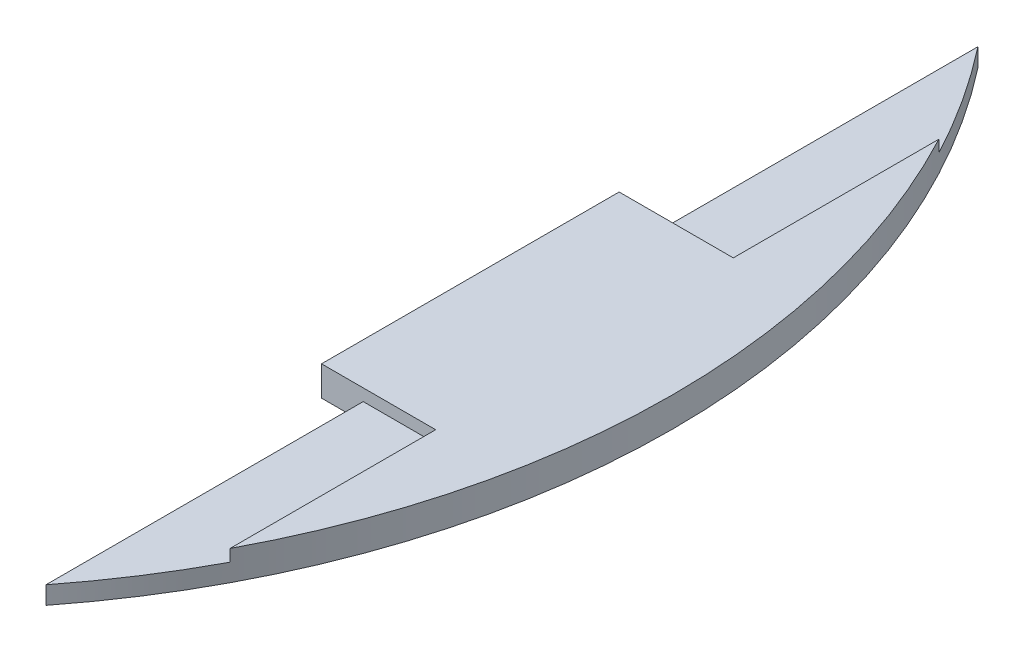
ISO-10303-21;
HEADER;
FILE_DESCRIPTION(('STEP AP214'),'2;1');
FILE_NAME('part.step','',(''),(''),'','','');
FILE_SCHEMA(('AUTOMOTIVE_DESIGN { 1 0 10303 214 1 1 1 1 }'));
ENDSEC;
DATA;
#1=APPLICATION_CONTEXT('core data for automotive mechanical design processes');
#2=APPLICATION_PROTOCOL_DEFINITION('international standard','automotive_design',2000,#1);
#3=PRODUCT_CONTEXT('',#1,'mechanical');
#4=PRODUCT('Part','Part','',(#3));
#5=PRODUCT_RELATED_PRODUCT_CATEGORY('part','',(#4));
#6=PRODUCT_DEFINITION_FORMATION('','',#4);
#7=PRODUCT_DEFINITION_CONTEXT('part definition',#1,'design');
#8=PRODUCT_DEFINITION('design','',#6,#7);
#9=PRODUCT_DEFINITION_SHAPE('','',#8);
#10=(LENGTH_UNIT() NAMED_UNIT(*) SI_UNIT(.MILLI.,.METRE.));
#11=(NAMED_UNIT(*) PLANE_ANGLE_UNIT() SI_UNIT($,.RADIAN.));
#12=(NAMED_UNIT(*) SI_UNIT($,.STERADIAN.) SOLID_ANGLE_UNIT());
#13=UNCERTAINTY_MEASURE_WITH_UNIT(LENGTH_MEASURE(1.E-05),#10,'distance_accuracy_value','');
#14=(GEOMETRIC_REPRESENTATION_CONTEXT(3) GLOBAL_UNCERTAINTY_ASSIGNED_CONTEXT((#13)) GLOBAL_UNIT_ASSIGNED_CONTEXT((#10,
#11,#12)) REPRESENTATION_CONTEXT('',''));
#15=CARTESIAN_POINT('',(0.,0.,0.));
#16=DIRECTION('',(0.,0.,1.));
#17=DIRECTION('',(1.,0.,0.));
#18=AXIS2_PLACEMENT_3D('',#15,#16,#17);
#19=CARTESIAN_POINT('',(50.,2.5,12.5));
#20=DIRECTION('',(1.,0.,0.));
#21=DIRECTION('',(0.,0.,-1.));
#22=AXIS2_PLACEMENT_3D('',#19,#20,#21);
#23=PLANE('',#22);
#24=DIRECTION('',(0.,0.,1.));
#25=VECTOR('',#24,1.);
#26=CARTESIAN_POINT('',(50.,1.5,12.5));
#27=LINE('',#26,#25);
#28=CARTESIAN_POINT('',(50.,1.5,12.5));
#29=VERTEX_POINT('',#28);
#30=CARTESIAN_POINT('',(50.,1.5,39.1439650520996));
#31=VERTEX_POINT('',#30);
#32=EDGE_CURVE('E181',#29,#31,#27,.T.);
#33=ORIENTED_EDGE('',*,*,#32,.F.);
#34=DIRECTION('',(0.,-1.,0.));
#35=VECTOR('',#34,1.);
#36=CARTESIAN_POINT('',(50.,2.5,12.5));
#37=LINE('',#36,#35);
#38=CARTESIAN_POINT('',(50.,0.,12.5));
#39=VERTEX_POINT('',#38);
#40=EDGE_CURVE('E152',#29,#39,#37,.T.);
#41=ORIENTED_EDGE('',*,*,#40,.T.);
#42=DIRECTION('',(0.,0.,1.));
#43=VECTOR('',#42,1.);
#44=CARTESIAN_POINT('',(50.,0.,12.5));
#45=LINE('',#44,#43);
#46=CARTESIAN_POINT('',(50.,0.,39.1439650520996));
#47=VERTEX_POINT('',#46);
#48=EDGE_CURVE('E118',#39,#47,#45,.T.);
#49=ORIENTED_EDGE('',*,*,#48,.T.);
#50=DIRECTION('',(0.,-1.,0.));
#51=VECTOR('',#50,1.);
#52=CARTESIAN_POINT('',(50.,2.5,39.1439650520996));
#53=LINE('',#52,#51);
#54=EDGE_CURVE('E149',#31,#47,#53,.T.);
#55=ORIENTED_EDGE('',*,*,#54,.F.);
#56=EDGE_LOOP('',(#33,#41,#49,#55));
#57=FACE_BOUND('',#56,.T.);
#58=ADVANCED_FACE('F43',(#57),#23,.F.);
#59=CARTESIAN_POINT('',(46.5,2.5,12.5));
#60=DIRECTION('',(0.,0.,-1.));
#61=DIRECTION('',(-1.,0.,0.));
#62=AXIS2_PLACEMENT_3D('',#59,#60,#61);
#63=PLANE('',#62);
#64=DIRECTION('',(1.,0.,0.));
#65=VECTOR('',#64,1.);
#66=CARTESIAN_POINT('',(46.5,0.,12.5));
#67=LINE('',#66,#65);
#68=CARTESIAN_POINT('',(46.5,0.,12.5));
#69=VERTEX_POINT('',#68);
#70=EDGE_CURVE('E110',#69,#39,#67,.T.);
#71=ORIENTED_EDGE('',*,*,#70,.T.);
#72=ORIENTED_EDGE('',*,*,#40,.F.);
#73=DIRECTION('',(-1.,0.,0.));
#74=VECTOR('',#73,1.);
#75=CARTESIAN_POINT('',(50.,1.5,12.5));
#76=LINE('',#75,#74);
#77=CARTESIAN_POINT('',(56.089,1.5,12.5));
#78=VERTEX_POINT('',#77);
#79=EDGE_CURVE('E190',#78,#29,#76,.T.);
#80=ORIENTED_EDGE('',*,*,#79,.F.);
#81=DIRECTION('',(0.,1.,0.));
#82=VECTOR('',#81,1.);
#83=CARTESIAN_POINT('',(56.089,1.5,12.5));
#84=LINE('',#83,#82);
#85=CARTESIAN_POINT('',(56.089,2.5,12.5));
#86=VERTEX_POINT('',#85);
#87=EDGE_CURVE('E194',#78,#86,#84,.T.);
#88=ORIENTED_EDGE('',*,*,#87,.T.);
#89=DIRECTION('',(1.,0.,0.));
#90=VECTOR('',#89,1.);
#91=CARTESIAN_POINT('',(46.5,2.5,12.5));
#92=LINE('',#91,#90);
#93=CARTESIAN_POINT('',(46.5,2.5,12.5));
#94=VERTEX_POINT('',#93);
#95=EDGE_CURVE('E104',#94,#86,#92,.T.);
#96=ORIENTED_EDGE('',*,*,#95,.F.);
#97=DIRECTION('',(0.,-1.,0.));
#98=VECTOR('',#97,1.);
#99=CARTESIAN_POINT('',(46.5,2.5,12.5));
#100=LINE('',#99,#98);
#101=EDGE_CURVE('E96',#94,#69,#100,.T.);
#102=ORIENTED_EDGE('',*,*,#101,.T.);
#103=EDGE_LOOP('',(#71,#72,#80,#88,#96,#102));
#104=FACE_BOUND('',#103,.T.);
#105=ADVANCED_FACE('F45',(#104),#63,.F.);
#106=CARTESIAN_POINT('',(0.,2.5,0.));
#107=DIRECTION('',(0.,-1.,0.));
#108=DIRECTION('',(0.,0.,-1.));
#109=AXIS2_PLACEMENT_3D('',#106,#107,#108);
#110=CYLINDRICAL_SURFACE('',#109,63.5);
#111=CARTESIAN_POINT('',(0.,1.5,0.));
#112=DIRECTION('',(0.,-1.,0.));
#113=DIRECTION('',(0.,0.,-1.));
#114=AXIS2_PLACEMENT_3D('',#111,#112,#113);
#115=CIRCLE('',#114,63.5);
#116=CARTESIAN_POINT('',(50.,1.5,-39.1439650520997));
#117=VERTEX_POINT('',#116);
#118=CARTESIAN_POINT('',(56.089,1.5,-29.7703557083217));
#119=VERTEX_POINT('',#118);
#120=EDGE_CURVE('E120',#117,#119,#115,.T.);
#121=ORIENTED_EDGE('',*,*,#120,.T.);
#122=DIRECTION('',(0.,-1.,0.));
#123=VECTOR('',#122,1.);
#124=CARTESIAN_POINT('',(56.089,2.5,-29.7703557083217));
#125=LINE('',#124,#123);
#126=CARTESIAN_POINT('',(56.089,2.5,-29.7703557083217));
#127=VERTEX_POINT('',#126);
#128=EDGE_CURVE('E127',#119,#127,#125,.F.);
#129=ORIENTED_EDGE('',*,*,#128,.T.);
#130=CARTESIAN_POINT('',(0.,2.5,0.));
#131=DIRECTION('',(0.,1.,0.));
#132=DIRECTION('',(0.,0.,-1.));
#133=AXIS2_PLACEMENT_3D('',#130,#131,#132);
#134=CIRCLE('',#133,63.5);
#135=CARTESIAN_POINT('',(56.089,2.5,29.7703557083217));
#136=VERTEX_POINT('',#135);
#137=EDGE_CURVE('E160',#136,#127,#134,.T.);
#138=ORIENTED_EDGE('',*,*,#137,.F.);
#139=DIRECTION('',(0.,-1.,0.));
#140=VECTOR('',#139,1.);
#141=CARTESIAN_POINT('',(56.089,2.5,29.7703557083217));
#142=LINE('',#141,#140);
#143=CARTESIAN_POINT('',(56.089,1.5,29.7703557083217));
#144=VERTEX_POINT('',#143);
#145=EDGE_CURVE('E59',#136,#144,#142,.T.);
#146=ORIENTED_EDGE('',*,*,#145,.T.);
#147=CARTESIAN_POINT('',(0.,1.5,0.));
#148=DIRECTION('',(0.,1.,0.));
#149=DIRECTION('',(0.,0.,1.));
#150=AXIS2_PLACEMENT_3D('',#147,#148,#149);
#151=CIRCLE('',#150,63.5);
#152=EDGE_CURVE('E11',#31,#144,#151,.T.);
#153=ORIENTED_EDGE('',*,*,#152,.F.);
#154=ORIENTED_EDGE('',*,*,#54,.T.);
#155=CARTESIAN_POINT('',(0.,0.,0.));
#156=DIRECTION('',(0.,1.,0.));
#157=DIRECTION('',(0.,0.,-1.));
#158=AXIS2_PLACEMENT_3D('',#155,#156,#157);
#159=CIRCLE('',#158,63.5);
#160=CARTESIAN_POINT('',(50.,0.,-39.1439650520997));
#161=VERTEX_POINT('',#160);
#162=EDGE_CURVE('E124',#47,#161,#159,.T.);
#163=ORIENTED_EDGE('',*,*,#162,.T.);
#164=DIRECTION('',(0.,-1.,0.));
#165=VECTOR('',#164,1.);
#166=CARTESIAN_POINT('',(50.,2.5,-39.1439650520997));
#167=LINE('',#166,#165);
#168=EDGE_CURVE('E146',#117,#161,#167,.T.);
#169=ORIENTED_EDGE('',*,*,#168,.F.);
#170=EDGE_LOOP('',(#121,#129,#138,#146,#153,#154,#163,#169));
#171=FACE_BOUND('',#170,.T.);
#172=ADVANCED_FACE('F165',(#171),#110,.T.);
#173=CARTESIAN_POINT('',(50.,2.5,-39.1439650520997));
#174=DIRECTION('',(1.,0.,0.));
#175=DIRECTION('',(0.,0.,-1.));
#176=AXIS2_PLACEMENT_3D('',#173,#174,#175);
#177=PLANE('',#176);
#178=DIRECTION('',(0.,-1.,0.));
#179=VECTOR('',#178,1.);
#180=CARTESIAN_POINT('',(50.,2.5,-12.5));
#181=LINE('',#180,#179);
#182=CARTESIAN_POINT('',(50.,1.5,-12.5));
#183=VERTEX_POINT('',#182);
#184=CARTESIAN_POINT('',(50.,0.,-12.5));
#185=VERTEX_POINT('',#184);
#186=EDGE_CURVE('E143',#183,#185,#181,.T.);
#187=ORIENTED_EDGE('',*,*,#186,.F.);
#188=DIRECTION('',(0.,0.,1.));
#189=VECTOR('',#188,1.);
#190=CARTESIAN_POINT('',(50.,1.5,-12.5));
#191=LINE('',#190,#189);
#192=EDGE_CURVE('E204',#117,#183,#191,.T.);
#193=ORIENTED_EDGE('',*,*,#192,.F.);
#194=ORIENTED_EDGE('',*,*,#168,.T.);
#195=DIRECTION('',(0.,0.,1.));
#196=VECTOR('',#195,1.);
#197=CARTESIAN_POINT('',(50.,0.,-39.1439650520997));
#198=LINE('',#197,#196);
#199=EDGE_CURVE('E135',#161,#185,#198,.T.);
#200=ORIENTED_EDGE('',*,*,#199,.T.);
#201=EDGE_LOOP('',(#187,#193,#194,#200));
#202=FACE_BOUND('',#201,.T.);
#203=ADVANCED_FACE('F231',(#202),#177,.F.);
#204=CARTESIAN_POINT('',(46.5,2.5,-12.5));
#205=DIRECTION('',(0.,0.,1.));
#206=DIRECTION('',(1.,0.,0.));
#207=AXIS2_PLACEMENT_3D('',#204,#205,#206);
#208=PLANE('',#207);
#209=DIRECTION('',(-1.,0.,0.));
#210=VECTOR('',#209,1.);
#211=CARTESIAN_POINT('',(46.5,0.,-12.5));
#212=LINE('',#211,#210);
#213=CARTESIAN_POINT('',(46.5,0.,-12.5));
#214=VERTEX_POINT('',#213);
#215=EDGE_CURVE('E105',#185,#214,#212,.T.);
#216=ORIENTED_EDGE('',*,*,#215,.T.);
#217=DIRECTION('',(0.,-1.,0.));
#218=VECTOR('',#217,1.);
#219=CARTESIAN_POINT('',(46.5,2.5,-12.5));
#220=LINE('',#219,#218);
#221=CARTESIAN_POINT('',(46.5,2.5,-12.5));
#222=VERTEX_POINT('',#221);
#223=EDGE_CURVE('E99',#222,#214,#220,.T.);
#224=ORIENTED_EDGE('',*,*,#223,.F.);
#225=DIRECTION('',(-1.,0.,0.));
#226=VECTOR('',#225,1.);
#227=CARTESIAN_POINT('',(46.5,2.5,-12.5));
#228=LINE('',#227,#226);
#229=CARTESIAN_POINT('',(56.089,2.5,-12.5));
#230=VERTEX_POINT('',#229);
#231=EDGE_CURVE('E170',#230,#222,#228,.T.);
#232=ORIENTED_EDGE('',*,*,#231,.F.);
#233=DIRECTION('',(0.,1.,0.));
#234=VECTOR('',#233,1.);
#235=CARTESIAN_POINT('',(56.089,1.5,-12.5));
#236=LINE('',#235,#234);
#237=CARTESIAN_POINT('',(56.089,1.5,-12.5));
#238=VERTEX_POINT('',#237);
#239=EDGE_CURVE('E180',#238,#230,#236,.T.);
#240=ORIENTED_EDGE('',*,*,#239,.F.);
#241=DIRECTION('',(1.,0.,0.));
#242=VECTOR('',#241,1.);
#243=CARTESIAN_POINT('',(50.,1.5,-12.5));
#244=LINE('',#243,#242);
#245=EDGE_CURVE('E208',#183,#238,#244,.T.);
#246=ORIENTED_EDGE('',*,*,#245,.F.);
#247=ORIENTED_EDGE('',*,*,#186,.T.);
#248=EDGE_LOOP('',(#216,#224,#232,#240,#246,#247));
#249=FACE_BOUND('',#248,.T.);
#250=ADVANCED_FACE('F228',(#249),#208,.F.);
#251=CARTESIAN_POINT('',(46.5,2.5,-12.5));
#252=DIRECTION('',(1.,0.,0.));
#253=DIRECTION('',(0.,0.,-1.));
#254=AXIS2_PLACEMENT_3D('',#251,#252,#253);
#255=PLANE('',#254);
#256=DIRECTION('',(0.,0.,1.));
#257=VECTOR('',#256,1.);
#258=CARTESIAN_POINT('',(46.5,0.,-12.5));
#259=LINE('',#258,#257);
#260=EDGE_CURVE('E93',#214,#69,#259,.T.);
#261=ORIENTED_EDGE('',*,*,#260,.T.);
#262=ORIENTED_EDGE('',*,*,#101,.F.);
#263=DIRECTION('',(0.,0.,1.));
#264=VECTOR('',#263,1.);
#265=CARTESIAN_POINT('',(46.5,2.5,-12.5));
#266=LINE('',#265,#264);
#267=EDGE_CURVE('E68',#222,#94,#266,.T.);
#268=ORIENTED_EDGE('',*,*,#267,.F.);
#269=ORIENTED_EDGE('',*,*,#223,.T.);
#270=EDGE_LOOP('',(#261,#262,#268,#269));
#271=FACE_BOUND('',#270,.T.);
#272=ADVANCED_FACE('F95',(#271),#255,.F.);
#273=CARTESIAN_POINT('',(0.,2.5,0.));
#274=DIRECTION('',(0.,-1.,0.));
#275=DIRECTION('',(0.,0.,-1.));
#276=AXIS2_PLACEMENT_3D('',#273,#274,#275);
#277=PLANE('',#276);
#278=ORIENTED_EDGE('',*,*,#137,.T.);
#279=DIRECTION('',(0.,0.,-1.));
#280=VECTOR('',#279,1.);
#281=CARTESIAN_POINT('',(56.089,2.5,-12.5));
#282=LINE('',#281,#280);
#283=EDGE_CURVE('E185',#230,#127,#282,.T.);
#284=ORIENTED_EDGE('',*,*,#283,.F.);
#285=ORIENTED_EDGE('',*,*,#231,.T.);
#286=ORIENTED_EDGE('',*,*,#267,.T.);
#287=ORIENTED_EDGE('',*,*,#95,.T.);
#288=DIRECTION('',(0.,0.,1.));
#289=VECTOR('',#288,1.);
#290=CARTESIAN_POINT('',(56.089,2.5,0.));
#291=LINE('',#290,#289);
#292=EDGE_CURVE('E52',#86,#136,#291,.T.);
#293=ORIENTED_EDGE('',*,*,#292,.T.);
#294=EDGE_LOOP('',(#278,#284,#285,#286,#287,#293));
#295=FACE_BOUND('',#294,.T.);
#296=ADVANCED_FACE('F157',(#295),#277,.F.);
#297=CARTESIAN_POINT('',(0.,0.,0.));
#298=DIRECTION('',(0.,-1.,0.));
#299=DIRECTION('',(0.,0.,-1.));
#300=AXIS2_PLACEMENT_3D('',#297,#298,#299);
#301=PLANE('',#300);
#302=ORIENTED_EDGE('',*,*,#70,.F.);
#303=ORIENTED_EDGE('',*,*,#260,.F.);
#304=ORIENTED_EDGE('',*,*,#215,.F.);
#305=ORIENTED_EDGE('',*,*,#199,.F.);
#306=ORIENTED_EDGE('',*,*,#162,.F.);
#307=ORIENTED_EDGE('',*,*,#48,.F.);
#308=EDGE_LOOP('',(#302,#303,#304,#305,#306,#307));
#309=FACE_BOUND('',#308,.T.);
#310=ADVANCED_FACE('F115',(#309),#301,.T.);
#311=CARTESIAN_POINT('',(0.,1.5,0.));
#312=DIRECTION('',(0.,1.,0.));
#313=DIRECTION('',(0.,0.,1.));
#314=AXIS2_PLACEMENT_3D('',#311,#312,#313);
#315=PLANE('',#314);
#316=ORIENTED_EDGE('',*,*,#152,.T.);
#317=DIRECTION('',(0.,0.,-1.));
#318=VECTOR('',#317,1.);
#319=CARTESIAN_POINT('',(56.089,1.5,12.5));
#320=LINE('',#319,#318);
#321=EDGE_CURVE('E186',#144,#78,#320,.T.);
#322=ORIENTED_EDGE('',*,*,#321,.T.);
#323=ORIENTED_EDGE('',*,*,#79,.T.);
#324=ORIENTED_EDGE('',*,*,#32,.T.);
#325=EDGE_LOOP('',(#316,#322,#323,#324));
#326=FACE_BOUND('',#325,.T.);
#327=ADVANCED_FACE('F252',(#326),#315,.T.);
#328=CARTESIAN_POINT('',(56.089,1.5,12.5));
#329=DIRECTION('',(1.,0.,0.));
#330=DIRECTION('',(0.,0.,-1.));
#331=AXIS2_PLACEMENT_3D('',#328,#329,#330);
#332=PLANE('',#331);
#333=ORIENTED_EDGE('',*,*,#292,.F.);
#334=ORIENTED_EDGE('',*,*,#87,.F.);
#335=ORIENTED_EDGE('',*,*,#321,.F.);
#336=ORIENTED_EDGE('',*,*,#145,.F.);
#337=EDGE_LOOP('',(#333,#334,#335,#336));
#338=FACE_BOUND('',#337,.T.);
#339=ADVANCED_FACE('F255',(#338),#332,.F.);
#340=CARTESIAN_POINT('',(0.,1.5,0.));
#341=DIRECTION('',(0.,-1.,0.));
#342=DIRECTION('',(0.,0.,-1.));
#343=AXIS2_PLACEMENT_3D('',#340,#341,#342);
#344=PLANE('',#343);
#345=ORIENTED_EDGE('',*,*,#192,.T.);
#346=ORIENTED_EDGE('',*,*,#245,.T.);
#347=DIRECTION('',(0.,0.,-1.));
#348=VECTOR('',#347,1.);
#349=CARTESIAN_POINT('',(56.089,1.5,-12.5));
#350=LINE('',#349,#348);
#351=EDGE_CURVE('E200',#238,#119,#350,.T.);
#352=ORIENTED_EDGE('',*,*,#351,.T.);
#353=ORIENTED_EDGE('',*,*,#120,.F.);
#354=EDGE_LOOP('',(#345,#346,#352,#353));
#355=FACE_BOUND('',#354,.T.);
#356=ADVANCED_FACE('F219',(#355),#344,.F.);
#357=CARTESIAN_POINT('',(56.089,1.5,-12.5));
#358=DIRECTION('',(1.,0.,0.));
#359=DIRECTION('',(0.,0.,-1.));
#360=AXIS2_PLACEMENT_3D('',#357,#358,#359);
#361=PLANE('',#360);
#362=ORIENTED_EDGE('',*,*,#351,.F.);
#363=ORIENTED_EDGE('',*,*,#239,.T.);
#364=ORIENTED_EDGE('',*,*,#283,.T.);
#365=ORIENTED_EDGE('',*,*,#128,.F.);
#366=EDGE_LOOP('',(#362,#363,#364,#365));
#367=FACE_BOUND('',#366,.T.);
#368=ADVANCED_FACE('F236',(#367),#361,.F.);
#369=CLOSED_SHELL('',(#58,#105,#172,#203,#250,#272,#296,#310,#327,#339,#356,#368));
#370=MANIFOLD_SOLID_BREP('B2',#369);
#371=ADVANCED_BREP_SHAPE_REPRESENTATION('',(#18,#370),#14);
#372=SHAPE_DEFINITION_REPRESENTATION(#9,#371);
ENDSEC;
END-ISO-10303-21;
